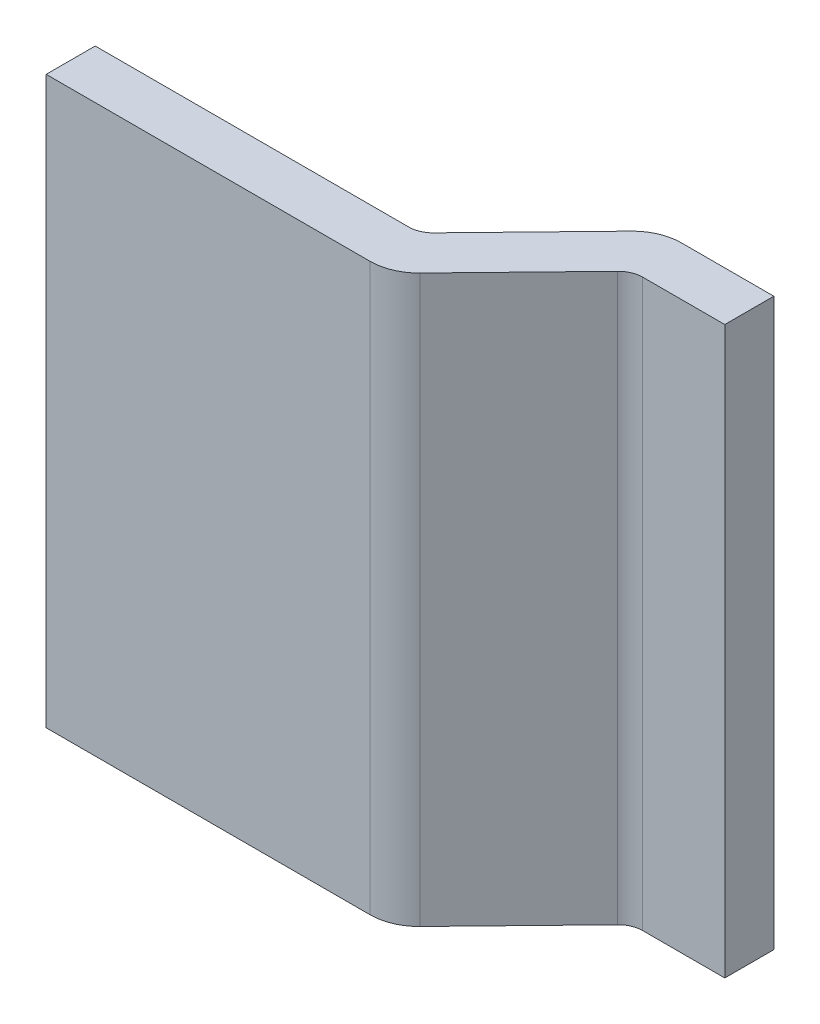
ISO-10303-21;
HEADER;
FILE_DESCRIPTION(('STEP AP214'),'2;1');
FILE_NAME('part.step','',(''),(''),'','','');
FILE_SCHEMA(('AUTOMOTIVE_DESIGN { 1 0 10303 214 1 1 1 1 }'));
ENDSEC;
DATA;
#1=APPLICATION_CONTEXT('core data for automotive mechanical design processes');
#2=APPLICATION_PROTOCOL_DEFINITION('international standard','automotive_design',2000,#1);
#3=PRODUCT_CONTEXT('',#1,'mechanical');
#4=PRODUCT('Part','Part','',(#3));
#5=PRODUCT_RELATED_PRODUCT_CATEGORY('part','',(#4));
#6=PRODUCT_DEFINITION_FORMATION('','',#4);
#7=PRODUCT_DEFINITION_CONTEXT('part definition',#1,'design');
#8=PRODUCT_DEFINITION('design','',#6,#7);
#9=PRODUCT_DEFINITION_SHAPE('','',#8);
#10=(LENGTH_UNIT() NAMED_UNIT(*) SI_UNIT(.MILLI.,.METRE.));
#11=(NAMED_UNIT(*) PLANE_ANGLE_UNIT() SI_UNIT($,.RADIAN.));
#12=(NAMED_UNIT(*) SI_UNIT($,.STERADIAN.) SOLID_ANGLE_UNIT());
#13=UNCERTAINTY_MEASURE_WITH_UNIT(LENGTH_MEASURE(1.E-05),#10,'distance_accuracy_value','');
#14=(GEOMETRIC_REPRESENTATION_CONTEXT(3) GLOBAL_UNCERTAINTY_ASSIGNED_CONTEXT((#13)) GLOBAL_UNIT_ASSIGNED_CONTEXT((#10,
#11,#12)) REPRESENTATION_CONTEXT('',''));
#15=CARTESIAN_POINT('',(0.,0.,0.));
#16=DIRECTION('',(0.,0.,1.));
#17=DIRECTION('',(1.,0.,0.));
#18=AXIS2_PLACEMENT_3D('',#15,#16,#17);
#19=CARTESIAN_POINT('',(2.026343195254,-1.5,0.455));
#20=DIRECTION('',(0.,1.,0.));
#21=DIRECTION('',(0.,0.,1.));
#22=AXIS2_PLACEMENT_3D('',#19,#20,#21);
#23=PLANE('',#22);
#24=DIRECTION('',(-0.696214228576379,0.,0.717834067126796));
#25=VECTOR('',#24,1.);
#26=CARTESIAN_POINT('',(2.456213658975,-1.5,0.831015699429859));
#27=LINE('',#26,#25);
#28=CARTESIAN_POINT('',(2.971728698849,-1.5,0.299492150285071));
#29=VERTEX_POINT('',#28);
#30=CARTESIAN_POINT('',(2.456213658975,-1.5,0.831015699429859));
#31=VERTEX_POINT('',#30);
#32=EDGE_CURVE('E11',#29,#31,#27,.T.);
#33=ORIENTED_EDGE('',*,*,#32,.T.);
#34=CARTESIAN_POINT('',(2.269576801522,-1.5,0.65));
#35=DIRECTION('',(0.,-1.,0.));
#36=DIRECTION('',(0.,0.,1.));
#37=AXIS2_PLACEMENT_3D('',#34,#35,#36);
#38=CIRCLE('',#37,0.26);
#39=CARTESIAN_POINT('',(2.269576801522,-1.5,0.91));
#40=VERTEX_POINT('',#39);
#41=EDGE_CURVE('E24',#31,#40,#38,.T.);
#42=ORIENTED_EDGE('',*,*,#41,.T.);
#43=DIRECTION('',(-1.,0.,0.));
#44=VECTOR('',#43,1.);
#45=CARTESIAN_POINT('',(0.552686390507766,-1.5,0.91));
#46=LINE('',#45,#44);
#47=CARTESIAN_POINT('',(0.552686390507766,-1.5,0.91));
#48=VERTEX_POINT('',#47);
#49=EDGE_CURVE('E123',#40,#48,#46,.T.);
#50=ORIENTED_EDGE('',*,*,#49,.T.);
#51=DIRECTION('',(0.,0.,-1.));
#52=VECTOR('',#51,1.);
#53=CARTESIAN_POINT('',(0.552686390507766,-1.5,0.65));
#54=LINE('',#53,#52);
#55=CARTESIAN_POINT('',(0.552686390507766,-1.5,0.65));
#56=VERTEX_POINT('',#55);
#57=EDGE_CURVE('E181',#48,#56,#54,.T.);
#58=ORIENTED_EDGE('',*,*,#57,.T.);
#59=DIRECTION('',(1.,0.,0.));
#60=VECTOR('',#59,1.);
#61=CARTESIAN_POINT('',(2.21456109233,-1.5,0.65));
#62=LINE('',#61,#60);
#63=CARTESIAN_POINT('',(2.21456109233,-1.5,0.65));
#64=VERTEX_POINT('',#63);
#65=EDGE_CURVE('E179',#56,#64,#62,.T.);
#66=ORIENTED_EDGE('',*,*,#65,.T.);
#67=CARTESIAN_POINT('',(2.21456109233,-1.5,0.52));
#68=DIRECTION('',(0.,1.,0.));
#69=DIRECTION('',(0.,0.,-1.));
#70=AXIS2_PLACEMENT_3D('',#67,#68,#69);
#71=CIRCLE('',#70,0.13);
#72=CARTESIAN_POINT('',(2.307879521056,-1.5,0.610507849714929));
#73=VERTEX_POINT('',#72);
#74=EDGE_CURVE('E177',#64,#73,#71,.T.);
#75=ORIENTED_EDGE('',*,*,#74,.T.);
#76=DIRECTION('',(0.696214228576379,0.,-0.717834067126796));
#77=VECTOR('',#76,1.);
#78=CARTESIAN_POINT('',(2.823394560931,-1.5,0.0789843005701413));
#79=LINE('',#78,#77);
#80=CARTESIAN_POINT('',(2.823394560931,-1.5,0.0789843005701413));
#81=VERTEX_POINT('',#80);
#82=EDGE_CURVE('E175',#73,#81,#79,.T.);
#83=ORIENTED_EDGE('',*,*,#82,.T.);
#84=CARTESIAN_POINT('',(3.010031418384,-1.5,0.26));
#85=DIRECTION('',(0.,-1.,0.));
#86=DIRECTION('',(0.,0.,-1.));
#87=AXIS2_PLACEMENT_3D('',#84,#85,#86);
#88=CIRCLE('',#87,0.26);
#89=CARTESIAN_POINT('',(3.010031418384,-1.5,0.));
#90=VERTEX_POINT('',#89);
#91=EDGE_CURVE('E173',#81,#90,#88,.T.);
#92=ORIENTED_EDGE('',*,*,#91,.T.);
#93=DIRECTION('',(1.,0.,0.));
#94=VECTOR('',#93,1.);
#95=CARTESIAN_POINT('',(3.5,-1.5,0.));
#96=LINE('',#95,#94);
#97=CARTESIAN_POINT('',(3.5,-1.5,0.));
#98=VERTEX_POINT('',#97);
#99=EDGE_CURVE('E171',#90,#98,#96,.T.);
#100=ORIENTED_EDGE('',*,*,#99,.T.);
#101=DIRECTION('',(0.,0.,1.));
#102=VECTOR('',#101,1.);
#103=CARTESIAN_POINT('',(3.5,-1.5,0.26));
#104=LINE('',#103,#102);
#105=CARTESIAN_POINT('',(3.5,-1.5,0.26));
#106=VERTEX_POINT('',#105);
#107=EDGE_CURVE('E169',#98,#106,#104,.T.);
#108=ORIENTED_EDGE('',*,*,#107,.T.);
#109=DIRECTION('',(-1.,0.,0.));
#110=VECTOR('',#109,1.);
#111=CARTESIAN_POINT('',(3.065047127576,-1.5,0.26));
#112=LINE('',#111,#110);
#113=CARTESIAN_POINT('',(3.065047127576,-1.5,0.26));
#114=VERTEX_POINT('',#113);
#115=EDGE_CURVE('E167',#106,#114,#112,.T.);
#116=ORIENTED_EDGE('',*,*,#115,.T.);
#117=CARTESIAN_POINT('',(3.065047127576,-1.5,0.39));
#118=DIRECTION('',(0.,1.,0.));
#119=DIRECTION('',(0.,0.,1.));
#120=AXIS2_PLACEMENT_3D('',#117,#118,#119);
#121=CIRCLE('',#120,0.13);
#122=EDGE_CURVE('E165',#114,#29,#121,.T.);
#123=ORIENTED_EDGE('',*,*,#122,.T.);
#124=EDGE_LOOP('',(#33,#42,#50,#58,#66,#75,#83,#92,#100,#108,#116,#123));
#125=FACE_BOUND('',#124,.T.);
#126=ADVANCED_FACE('F17',(#125),#23,.F.);
#127=CARTESIAN_POINT('',(2.026343195254,1.5,0.455));
#128=DIRECTION('',(0.,1.,0.));
#129=DIRECTION('',(0.,0.,1.));
#130=AXIS2_PLACEMENT_3D('',#127,#128,#129);
#131=PLANE('',#130);
#132=DIRECTION('',(0.696214228576379,0.,-0.717834067126796));
#133=VECTOR('',#132,1.);
#134=CARTESIAN_POINT('',(2.456213658975,1.5,0.831015699429859));
#135=LINE('',#134,#133);
#136=CARTESIAN_POINT('',(2.456213658975,1.5,0.831015699429859));
#137=VERTEX_POINT('',#136);
#138=CARTESIAN_POINT('',(2.971728698849,1.5,0.299492150285071));
#139=VERTEX_POINT('',#138);
#140=EDGE_CURVE('E163',#137,#139,#135,.T.);
#141=ORIENTED_EDGE('',*,*,#140,.T.);
#142=CARTESIAN_POINT('',(3.065047127576,1.5,0.39));
#143=DIRECTION('',(0.,-1.,0.));
#144=DIRECTION('',(0.,0.,1.));
#145=AXIS2_PLACEMENT_3D('',#142,#143,#144);
#146=CIRCLE('',#145,0.13);
#147=CARTESIAN_POINT('',(3.065047127576,1.5,0.26));
#148=VERTEX_POINT('',#147);
#149=EDGE_CURVE('E161',#139,#148,#146,.T.);
#150=ORIENTED_EDGE('',*,*,#149,.T.);
#151=DIRECTION('',(1.,0.,0.));
#152=VECTOR('',#151,1.);
#153=CARTESIAN_POINT('',(3.065047127576,1.5,0.26));
#154=LINE('',#153,#152);
#155=CARTESIAN_POINT('',(3.5,1.5,0.26));
#156=VERTEX_POINT('',#155);
#157=EDGE_CURVE('E159',#148,#156,#154,.T.);
#158=ORIENTED_EDGE('',*,*,#157,.T.);
#159=DIRECTION('',(0.,0.,-1.));
#160=VECTOR('',#159,1.);
#161=CARTESIAN_POINT('',(3.5,1.5,0.26));
#162=LINE('',#161,#160);
#163=CARTESIAN_POINT('',(3.5,1.5,0.));
#164=VERTEX_POINT('',#163);
#165=EDGE_CURVE('E157',#156,#164,#162,.T.);
#166=ORIENTED_EDGE('',*,*,#165,.T.);
#167=DIRECTION('',(-1.,0.,0.));
#168=VECTOR('',#167,1.);
#169=CARTESIAN_POINT('',(3.5,1.5,0.));
#170=LINE('',#169,#168);
#171=CARTESIAN_POINT('',(3.010031418384,1.5,0.));
#172=VERTEX_POINT('',#171);
#173=EDGE_CURVE('E155',#164,#172,#170,.T.);
#174=ORIENTED_EDGE('',*,*,#173,.T.);
#175=CARTESIAN_POINT('',(3.010031418384,1.5,0.26));
#176=DIRECTION('',(0.,1.,0.));
#177=DIRECTION('',(0.,0.,-1.));
#178=AXIS2_PLACEMENT_3D('',#175,#176,#177);
#179=CIRCLE('',#178,0.26);
#180=CARTESIAN_POINT('',(2.823394560931,1.5,0.0789843005701413));
#181=VERTEX_POINT('',#180);
#182=EDGE_CURVE('E153',#172,#181,#179,.T.);
#183=ORIENTED_EDGE('',*,*,#182,.T.);
#184=DIRECTION('',(-0.696214228576379,0.,0.717834067126796));
#185=VECTOR('',#184,1.);
#186=CARTESIAN_POINT('',(2.823394560931,1.5,0.0789843005701413));
#187=LINE('',#186,#185);
#188=CARTESIAN_POINT('',(2.307879521056,1.5,0.610507849714929));
#189=VERTEX_POINT('',#188);
#190=EDGE_CURVE('E151',#181,#189,#187,.T.);
#191=ORIENTED_EDGE('',*,*,#190,.T.);
#192=CARTESIAN_POINT('',(2.21456109233,1.5,0.52));
#193=DIRECTION('',(0.,-1.,0.));
#194=DIRECTION('',(0.,0.,-1.));
#195=AXIS2_PLACEMENT_3D('',#192,#193,#194);
#196=CIRCLE('',#195,0.13);
#197=CARTESIAN_POINT('',(2.21456109233,1.5,0.65));
#198=VERTEX_POINT('',#197);
#199=EDGE_CURVE('E149',#189,#198,#196,.T.);
#200=ORIENTED_EDGE('',*,*,#199,.T.);
#201=DIRECTION('',(-1.,0.,0.));
#202=VECTOR('',#201,1.);
#203=CARTESIAN_POINT('',(2.21456109233,1.5,0.65));
#204=LINE('',#203,#202);
#205=CARTESIAN_POINT('',(0.552686390507766,1.5,0.65));
#206=VERTEX_POINT('',#205);
#207=EDGE_CURVE('E147',#198,#206,#204,.T.);
#208=ORIENTED_EDGE('',*,*,#207,.T.);
#209=DIRECTION('',(0.,0.,1.));
#210=VECTOR('',#209,1.);
#211=CARTESIAN_POINT('',(0.552686390507766,1.5,0.65));
#212=LINE('',#211,#210);
#213=CARTESIAN_POINT('',(0.552686390507766,1.5,0.91));
#214=VERTEX_POINT('',#213);
#215=EDGE_CURVE('E108',#206,#214,#212,.T.);
#216=ORIENTED_EDGE('',*,*,#215,.T.);
#217=DIRECTION('',(1.,0.,0.));
#218=VECTOR('',#217,1.);
#219=CARTESIAN_POINT('',(0.552686390507766,1.5,0.91));
#220=LINE('',#219,#218);
#221=CARTESIAN_POINT('',(2.269576801522,1.5,0.91));
#222=VERTEX_POINT('',#221);
#223=EDGE_CURVE('E102',#214,#222,#220,.T.);
#224=ORIENTED_EDGE('',*,*,#223,.T.);
#225=CARTESIAN_POINT('',(2.269576801522,1.5,0.65));
#226=DIRECTION('',(0.,1.,0.));
#227=DIRECTION('',(0.,0.,1.));
#228=AXIS2_PLACEMENT_3D('',#225,#226,#227);
#229=CIRCLE('',#228,0.26);
#230=EDGE_CURVE('E105',#222,#137,#229,.T.);
#231=ORIENTED_EDGE('',*,*,#230,.T.);
#232=EDGE_LOOP('',(#141,#150,#158,#166,#174,#183,#191,#200,#208,#216,#224,#231));
#233=FACE_BOUND('',#232,.T.);
#234=ADVANCED_FACE('F104',(#233),#131,.T.);
#235=CARTESIAN_POINT('',(3.065047127576,0.,0.39));
#236=DIRECTION('',(0.,1.,0.));
#237=DIRECTION('',(-0.389734378406383,0.,-0.92092731216323));
#238=AXIS2_PLACEMENT_3D('',#235,#236,#237);
#239=CYLINDRICAL_SURFACE('',#238,0.13);
#240=DIRECTION('',(0.,1.,0.));
#241=VECTOR('',#240,1.);
#242=CARTESIAN_POINT('',(3.065047127576,0.,0.26));
#243=LINE('',#242,#241);
#244=EDGE_CURVE('E119',#114,#148,#243,.T.);
#245=ORIENTED_EDGE('',*,*,#244,.T.);
#246=ORIENTED_EDGE('',*,*,#149,.F.);
#247=DIRECTION('',(0.,-1.,0.));
#248=VECTOR('',#247,1.);
#249=CARTESIAN_POINT('',(2.971728698849,0.,0.299492150285071));
#250=LINE('',#249,#248);
#251=EDGE_CURVE('E141',#139,#29,#250,.T.);
#252=ORIENTED_EDGE('',*,*,#251,.T.);
#253=ORIENTED_EDGE('',*,*,#122,.F.);
#254=EDGE_LOOP('',(#245,#246,#252,#253));
#255=FACE_BOUND('',#254,.T.);
#256=ADVANCED_FACE('F188',(#255),#239,.F.);
#257=CARTESIAN_POINT('',(3.010031418384,0.,0.26));
#258=DIRECTION('',(0.,0.,1.));
#259=DIRECTION('',(1.,0.,0.));
#260=AXIS2_PLACEMENT_3D('',#257,#258,#259);
#261=PLANE('',#260);
#262=ORIENTED_EDGE('',*,*,#244,.F.);
#263=ORIENTED_EDGE('',*,*,#115,.F.);
#264=DIRECTION('',(0.,1.,0.));
#265=VECTOR('',#264,1.);
#266=CARTESIAN_POINT('',(3.5,0.,0.26));
#267=LINE('',#266,#265);
#268=EDGE_CURVE('E138',#106,#156,#267,.T.);
#269=ORIENTED_EDGE('',*,*,#268,.T.);
#270=ORIENTED_EDGE('',*,*,#157,.F.);
#271=EDGE_LOOP('',(#262,#263,#269,#270));
#272=FACE_BOUND('',#271,.T.);
#273=ADVANCED_FACE('F193',(#272),#261,.T.);
#274=CARTESIAN_POINT('',(2.21456109233,0.,0.52));
#275=DIRECTION('',(0.,1.,0.));
#276=DIRECTION('',(0.389734378406383,0.,0.920927312163229));
#277=AXIS2_PLACEMENT_3D('',#274,#275,#276);
#278=CYLINDRICAL_SURFACE('',#277,0.13);
#279=DIRECTION('',(0.,1.,0.));
#280=VECTOR('',#279,1.);
#281=CARTESIAN_POINT('',(2.21456109233,0.,0.65));
#282=LINE('',#281,#280);
#283=EDGE_CURVE('E135',#64,#198,#282,.T.);
#284=ORIENTED_EDGE('',*,*,#283,.T.);
#285=ORIENTED_EDGE('',*,*,#199,.F.);
#286=DIRECTION('',(0.,-1.,0.));
#287=VECTOR('',#286,1.);
#288=CARTESIAN_POINT('',(2.307879521056,0.,0.610507849714929));
#289=LINE('',#288,#287);
#290=EDGE_CURVE('E127',#189,#73,#289,.T.);
#291=ORIENTED_EDGE('',*,*,#290,.T.);
#292=ORIENTED_EDGE('',*,*,#74,.F.);
#293=EDGE_LOOP('',(#284,#285,#291,#292));
#294=FACE_BOUND('',#293,.T.);
#295=ADVANCED_FACE('F227',(#294),#278,.F.);
#296=CARTESIAN_POINT('',(2.269576801522,0.,0.65));
#297=DIRECTION('',(0.,0.,-1.));
#298=DIRECTION('',(-1.,0.,0.));
#299=AXIS2_PLACEMENT_3D('',#296,#297,#298);
#300=PLANE('',#299);
#301=ORIENTED_EDGE('',*,*,#283,.F.);
#302=ORIENTED_EDGE('',*,*,#65,.F.);
#303=DIRECTION('',(0.,-1.,0.));
#304=VECTOR('',#303,1.);
#305=CARTESIAN_POINT('',(0.552686390507766,0.,0.65));
#306=LINE('',#305,#304);
#307=EDGE_CURVE('E124',#206,#56,#306,.T.);
#308=ORIENTED_EDGE('',*,*,#307,.F.);
#309=ORIENTED_EDGE('',*,*,#207,.F.);
#310=EDGE_LOOP('',(#301,#302,#308,#309));
#311=FACE_BOUND('',#310,.T.);
#312=ADVANCED_FACE('F232',(#311),#300,.T.);
#313=CARTESIAN_POINT('',(2.269576801522,0.,0.65));
#314=DIRECTION('',(0.,1.,0.));
#315=DIRECTION('',(0.389734378406384,0.,0.920927312163229));
#316=AXIS2_PLACEMENT_3D('',#313,#314,#315);
#317=CYLINDRICAL_SURFACE('',#316,0.26);
#318=DIRECTION('',(0.,-1.,0.));
#319=VECTOR('',#318,1.);
#320=CARTESIAN_POINT('',(2.269576801522,0.,0.91));
#321=LINE('',#320,#319);
#322=EDGE_CURVE('E117',#222,#40,#321,.T.);
#323=ORIENTED_EDGE('',*,*,#322,.T.);
#324=ORIENTED_EDGE('',*,*,#41,.F.);
#325=DIRECTION('',(0.,1.,0.));
#326=VECTOR('',#325,1.);
#327=CARTESIAN_POINT('',(2.456213658975,0.,0.831015699429859));
#328=LINE('',#327,#326);
#329=EDGE_CURVE('E118',#31,#137,#328,.T.);
#330=ORIENTED_EDGE('',*,*,#329,.T.);
#331=ORIENTED_EDGE('',*,*,#230,.F.);
#332=EDGE_LOOP('',(#323,#324,#330,#331));
#333=FACE_BOUND('',#332,.T.);
#334=ADVANCED_FACE('F116',(#333),#317,.T.);
#335=CARTESIAN_POINT('',(2.379608219906,0.,0.91));
#336=DIRECTION('',(0.717834067126796,0.,0.696214228576379));
#337=DIRECTION('',(0.696214228576379,0.,-0.717834067126796));
#338=AXIS2_PLACEMENT_3D('',#335,#336,#337);
#339=PLANE('',#338);
#340=ORIENTED_EDGE('',*,*,#251,.F.);
#341=ORIENTED_EDGE('',*,*,#140,.F.);
#342=ORIENTED_EDGE('',*,*,#329,.F.);
#343=ORIENTED_EDGE('',*,*,#32,.F.);
#344=EDGE_LOOP('',(#340,#341,#342,#343));
#345=FACE_BOUND('',#344,.T.);
#346=ADVANCED_FACE('F184',(#345),#339,.T.);
#347=CARTESIAN_POINT('',(3.010031418384,0.,0.26));
#348=DIRECTION('',(0.,1.,0.));
#349=DIRECTION('',(-0.389734378406383,0.,-0.920927312163229));
#350=AXIS2_PLACEMENT_3D('',#347,#348,#349);
#351=CYLINDRICAL_SURFACE('',#350,0.26);
#352=DIRECTION('',(0.,-1.,0.));
#353=VECTOR('',#352,1.);
#354=CARTESIAN_POINT('',(3.010031418384,0.,0.));
#355=LINE('',#354,#353);
#356=EDGE_CURVE('E129',#172,#90,#355,.T.);
#357=ORIENTED_EDGE('',*,*,#356,.T.);
#358=ORIENTED_EDGE('',*,*,#91,.F.);
#359=DIRECTION('',(0.,1.,0.));
#360=VECTOR('',#359,1.);
#361=CARTESIAN_POINT('',(2.823394560931,0.,0.0789843005701413));
#362=LINE('',#361,#360);
#363=EDGE_CURVE('E205',#81,#181,#362,.T.);
#364=ORIENTED_EDGE('',*,*,#363,.T.);
#365=ORIENTED_EDGE('',*,*,#182,.F.);
#366=EDGE_LOOP('',(#357,#358,#364,#365));
#367=FACE_BOUND('',#366,.T.);
#368=ADVANCED_FACE('F216',(#367),#351,.T.);
#369=CARTESIAN_POINT('',(2.9,0.,0.));
#370=DIRECTION('',(-0.717834067126796,0.,-0.696214228576379));
#371=DIRECTION('',(-0.696214228576379,0.,0.717834067126796));
#372=AXIS2_PLACEMENT_3D('',#369,#370,#371);
#373=PLANE('',#372);
#374=ORIENTED_EDGE('',*,*,#290,.F.);
#375=ORIENTED_EDGE('',*,*,#190,.F.);
#376=ORIENTED_EDGE('',*,*,#363,.F.);
#377=ORIENTED_EDGE('',*,*,#82,.F.);
#378=EDGE_LOOP('',(#374,#375,#376,#377));
#379=FACE_BOUND('',#378,.T.);
#380=ADVANCED_FACE('F223',(#379),#373,.T.);
#381=CARTESIAN_POINT('',(3.5,0.,0.));
#382=DIRECTION('',(0.,0.,-1.));
#383=DIRECTION('',(-1.,0.,0.));
#384=AXIS2_PLACEMENT_3D('',#381,#382,#383);
#385=PLANE('',#384);
#386=ORIENTED_EDGE('',*,*,#356,.F.);
#387=ORIENTED_EDGE('',*,*,#173,.F.);
#388=DIRECTION('',(0.,1.,0.));
#389=VECTOR('',#388,1.);
#390=CARTESIAN_POINT('',(3.5,0.,0.));
#391=LINE('',#390,#389);
#392=EDGE_CURVE('E202',#98,#164,#391,.T.);
#393=ORIENTED_EDGE('',*,*,#392,.F.);
#394=ORIENTED_EDGE('',*,*,#99,.F.);
#395=EDGE_LOOP('',(#386,#387,#393,#394));
#396=FACE_BOUND('',#395,.T.);
#397=ADVANCED_FACE('F218',(#396),#385,.T.);
#398=CARTESIAN_POINT('',(3.5,0.,0.26));
#399=DIRECTION('',(1.,0.,0.));
#400=DIRECTION('',(0.,0.,-1.));
#401=AXIS2_PLACEMENT_3D('',#398,#399,#400);
#402=PLANE('',#401);
#403=ORIENTED_EDGE('',*,*,#392,.T.);
#404=ORIENTED_EDGE('',*,*,#165,.F.);
#405=ORIENTED_EDGE('',*,*,#268,.F.);
#406=ORIENTED_EDGE('',*,*,#107,.F.);
#407=EDGE_LOOP('',(#403,#404,#405,#406));
#408=FACE_BOUND('',#407,.T.);
#409=ADVANCED_FACE('F199',(#408),#402,.T.);
#410=CARTESIAN_POINT('',(0.552686390507766,0.,0.91));
#411=DIRECTION('',(0.,0.,1.));
#412=DIRECTION('',(1.,0.,0.));
#413=AXIS2_PLACEMENT_3D('',#410,#411,#412);
#414=PLANE('',#413);
#415=ORIENTED_EDGE('',*,*,#322,.F.);
#416=ORIENTED_EDGE('',*,*,#223,.F.);
#417=DIRECTION('',(0.,1.,0.));
#418=VECTOR('',#417,1.);
#419=CARTESIAN_POINT('',(0.552686390507766,0.,0.91));
#420=LINE('',#419,#418);
#421=EDGE_CURVE('E206',#48,#214,#420,.T.);
#422=ORIENTED_EDGE('',*,*,#421,.F.);
#423=ORIENTED_EDGE('',*,*,#49,.F.);
#424=EDGE_LOOP('',(#415,#416,#422,#423));
#425=FACE_BOUND('',#424,.T.);
#426=ADVANCED_FACE('F122',(#425),#414,.T.);
#427=CARTESIAN_POINT('',(0.552686390507766,0.,0.65));
#428=DIRECTION('',(-1.,0.,0.));
#429=DIRECTION('',(0.,0.,1.));
#430=AXIS2_PLACEMENT_3D('',#427,#428,#429);
#431=PLANE('',#430);
#432=ORIENTED_EDGE('',*,*,#421,.T.);
#433=ORIENTED_EDGE('',*,*,#215,.F.);
#434=ORIENTED_EDGE('',*,*,#307,.T.);
#435=ORIENTED_EDGE('',*,*,#57,.F.);
#436=EDGE_LOOP('',(#432,#433,#434,#435));
#437=FACE_BOUND('',#436,.T.);
#438=ADVANCED_FACE('F235',(#437),#431,.T.);
#439=CLOSED_SHELL('',(#126,#234,#256,#273,#295,#312,#334,#346,#368,#380,#397,#409,#426,#438));
#440=MANIFOLD_SOLID_BREP('B1',#439);
#441=ADVANCED_BREP_SHAPE_REPRESENTATION('',(#18,#440),#14);
#442=SHAPE_DEFINITION_REPRESENTATION(#9,#441);
ENDSEC;
END-ISO-10303-21;
